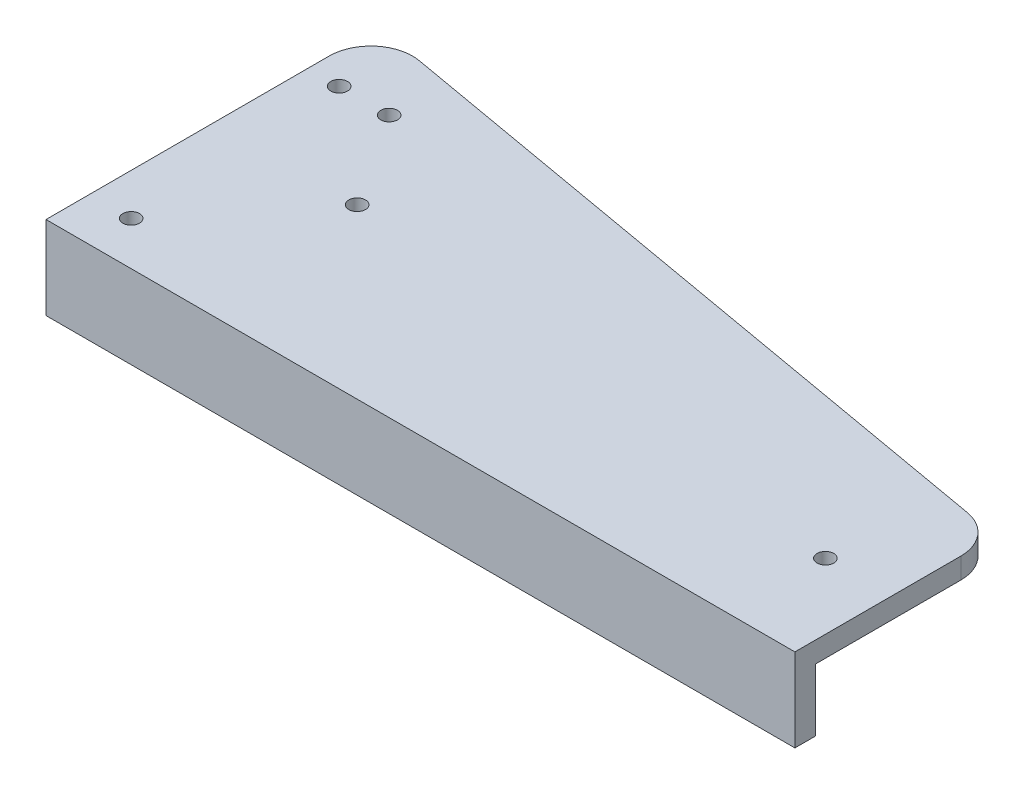
ISO-10303-21;
HEADER;
FILE_DESCRIPTION(('STEP AP214'),'2;1');
FILE_NAME('part.step','',(''),(''),'','','');
FILE_SCHEMA(('AUTOMOTIVE_DESIGN { 1 0 10303 214 1 1 1 1 }'));
ENDSEC;
DATA;
#1=APPLICATION_CONTEXT('core data for automotive mechanical design processes');
#2=APPLICATION_PROTOCOL_DEFINITION('international standard','automotive_design',2000,#1);
#3=PRODUCT_CONTEXT('',#1,'mechanical');
#4=PRODUCT('Part','Part','',(#3));
#5=PRODUCT_RELATED_PRODUCT_CATEGORY('part','',(#4));
#6=PRODUCT_DEFINITION_FORMATION('','',#4);
#7=PRODUCT_DEFINITION_CONTEXT('part definition',#1,'design');
#8=PRODUCT_DEFINITION('design','',#6,#7);
#9=PRODUCT_DEFINITION_SHAPE('','',#8);
#10=(LENGTH_UNIT() NAMED_UNIT(*) SI_UNIT(.MILLI.,.METRE.));
#11=(NAMED_UNIT(*) PLANE_ANGLE_UNIT() SI_UNIT($,.RADIAN.));
#12=(NAMED_UNIT(*) SI_UNIT($,.STERADIAN.) SOLID_ANGLE_UNIT());
#13=UNCERTAINTY_MEASURE_WITH_UNIT(LENGTH_MEASURE(1.E-05),#10,'distance_accuracy_value','');
#14=(GEOMETRIC_REPRESENTATION_CONTEXT(3) GLOBAL_UNCERTAINTY_ASSIGNED_CONTEXT((#13)) GLOBAL_UNIT_ASSIGNED_CONTEXT((#10,
#11,#12)) REPRESENTATION_CONTEXT('',''));
#15=CARTESIAN_POINT('',(0.,0.,0.));
#16=DIRECTION('',(0.,0.,1.));
#17=DIRECTION('',(1.,0.,0.));
#18=AXIS2_PLACEMENT_3D('',#15,#16,#17);
#19=CARTESIAN_POINT('',(0.,0.,0.));
#20=DIRECTION('',(0.,1.,0.));
#21=DIRECTION('',(0.,0.,1.));
#22=AXIS2_PLACEMENT_3D('',#19,#20,#21);
#23=PLANE('',#22);
#24=CARTESIAN_POINT('',(-34.0680960469009,0.,-28.575));
#25=DIRECTION('',(0.,1.,0.));
#26=DIRECTION('',(0.,0.,1.));
#27=AXIS2_PLACEMENT_3D('',#24,#25,#26);
#28=CIRCLE('',#27,2.5527);
#29=CARTESIAN_POINT('',(-34.0680960469009,0.,-26.0223));
#30=VERTEX_POINT('',#29);
#31=EDGE_CURVE('E183',#30,#30,#28,.T.);
#32=ORIENTED_EDGE('',*,*,#31,.T.);
#33=EDGE_LOOP('',(#32));
#34=FACE_BOUND('',#33,.T.);
#35=CARTESIAN_POINT('',(-18.8280960469009,0.,-28.575));
#36=DIRECTION('',(0.,1.,0.));
#37=DIRECTION('',(0.,0.,1.));
#38=AXIS2_PLACEMENT_3D('',#35,#36,#37);
#39=CIRCLE('',#38,2.5527);
#40=CARTESIAN_POINT('',(-18.8280960469009,0.,-26.0223));
#41=VERTEX_POINT('',#40);
#42=EDGE_CURVE('E151',#41,#41,#39,.T.);
#43=ORIENTED_EDGE('',*,*,#42,.T.);
#44=EDGE_LOOP('',(#43));
#45=FACE_BOUND('',#44,.T.);
#46=CARTESIAN_POINT('',(0.,0.,0.));
#47=DIRECTION('',(0.,1.,0.));
#48=DIRECTION('',(0.,0.,1.));
#49=AXIS2_PLACEMENT_3D('',#46,#47,#48);
#50=CIRCLE('',#49,2.5527);
#51=CARTESIAN_POINT('',(0.,0.,2.5527));
#52=VERTEX_POINT('',#51);
#53=EDGE_CURVE('E146',#52,#52,#50,.T.);
#54=ORIENTED_EDGE('',*,*,#53,.T.);
#55=EDGE_LOOP('',(#54));
#56=FACE_BOUND('',#55,.T.);
#57=CARTESIAN_POINT('',(-30.8930960469009,0.,38.1));
#58=DIRECTION('',(0.,1.,0.));
#59=DIRECTION('',(0.,0.,1.));
#60=AXIS2_PLACEMENT_3D('',#57,#58,#59);
#61=CIRCLE('',#60,2.5527);
#62=CARTESIAN_POINT('',(-30.8930960469009,0.,40.6527));
#63=VERTEX_POINT('',#62);
#64=EDGE_CURVE('E195',#63,#63,#61,.T.);
#65=ORIENTED_EDGE('',*,*,#64,.T.);
#66=EDGE_LOOP('',(#65));
#67=FACE_BOUND('',#66,.T.);
#68=CARTESIAN_POINT('',(164.907701135125,0.,21.9875101453017));
#69=DIRECTION('',(0.,1.,0.));
#70=DIRECTION('',(0.,0.,1.));
#71=AXIS2_PLACEMENT_3D('',#68,#69,#70);
#72=CIRCLE('',#71,2.55269999999999);
#73=CARTESIAN_POINT('',(164.907701135125,0.,24.5402101453017));
#74=VERTEX_POINT('',#73);
#75=EDGE_CURVE('E201',#74,#74,#72,.T.);
#76=ORIENTED_EDGE('',*,*,#75,.T.);
#77=EDGE_LOOP('',(#76));
#78=FACE_BOUND('',#77,.T.);
#79=DIRECTION('',(0.,0.,1.));
#80=VECTOR('',#79,1.);
#81=CARTESIAN_POINT('',(-43.5930960469009,0.,-50.2022855012514));
#82=LINE('',#81,#80);
#83=CARTESIAN_POINT('',(-43.5930960469009,0.,-35.067014875305));
#84=VERTEX_POINT('',#83);
#85=CARTESIAN_POINT('',(-43.5930960469009,0.,45.0477144987486));
#86=VERTEX_POINT('',#85);
#87=EDGE_CURVE('E125',#84,#86,#82,.T.);
#88=ORIENTED_EDGE('',*,*,#87,.F.);
#89=CARTESIAN_POINT('',(-30.8930960469009,0.,-35.067014875305));
#90=DIRECTION('',(0.,1.,0.));
#91=DIRECTION('',(0.,0.,1.));
#92=AXIS2_PLACEMENT_3D('',#89,#90,#91);
#93=CIRCLE('',#92,12.7);
#94=CARTESIAN_POINT('',(-28.687764190531,0.,-47.5740733385601));
#95=VERTEX_POINT('',#94);
#96=EDGE_CURVE('E158',#84,#95,#93,.F.);
#97=ORIENTED_EDGE('',*,*,#96,.T.);
#98=DIRECTION('',(0.984807753012209,0.,0.173648177666923));
#99=VECTOR('',#98,1.);
#100=CARTESIAN_POINT('',(7.27060375399845,0.,-41.2336428876974));
#101=LINE('',#100,#99);
#102=CARTESIAN_POINT('',(174.512235809469,0.,-11.7444308586015));
#103=VERTEX_POINT('',#102);
#104=EDGE_CURVE('E176',#95,#103,#101,.T.);
#105=ORIENTED_EDGE('',*,*,#104,.T.);
#106=CARTESIAN_POINT('',(172.306903953099,0.,0.762627604653579));
#107=DIRECTION('',(0.,1.,0.));
#108=DIRECTION('',(0.,0.,1.));
#109=AXIS2_PLACEMENT_3D('',#106,#107,#108);
#110=CIRCLE('',#109,12.7);
#111=CARTESIAN_POINT('',(185.006903953099,0.,0.762627604653579));
#112=VERTEX_POINT('',#111);
#113=EDGE_CURVE('E156',#103,#112,#110,.F.);
#114=ORIENTED_EDGE('',*,*,#113,.T.);
#115=DIRECTION('',(0.,0.,-1.));
#116=VECTOR('',#115,1.);
#117=CARTESIAN_POINT('',(185.006903953099,0.,-50.2022855012514));
#118=LINE('',#117,#116);
#119=CARTESIAN_POINT('',(185.006903953099,0.,45.0477144987486));
#120=VERTEX_POINT('',#119);
#121=EDGE_CURVE('E128',#120,#112,#118,.T.);
#122=ORIENTED_EDGE('',*,*,#121,.F.);
#123=DIRECTION('',(1.,0.,0.));
#124=VECTOR('',#123,1.);
#125=CARTESIAN_POINT('',(-43.5930960469009,0.,45.0477144987486));
#126=LINE('',#125,#124);
#127=EDGE_CURVE('E119',#86,#120,#126,.T.);
#128=ORIENTED_EDGE('',*,*,#127,.F.);
#129=EDGE_LOOP('',(#88,#97,#105,#114,#122,#128));
#130=FACE_BOUND('',#129,.T.);
#131=ADVANCED_FACE('F33',(#34,#45,#56,#67,#78,#130),#23,.F.);
#132=CARTESIAN_POINT('',(-43.5930960469009,6.35,-50.2022855012514));
#133=DIRECTION('',(1.,0.,0.));
#134=DIRECTION('',(0.,0.,-1.));
#135=AXIS2_PLACEMENT_3D('',#132,#133,#134);
#136=PLANE('',#135);
#137=DIRECTION('',(0.,0.,1.));
#138=VECTOR('',#137,1.);
#139=CARTESIAN_POINT('',(-43.5930960469009,6.35,-50.2022855012514));
#140=LINE('',#139,#138);
#141=CARTESIAN_POINT('',(-43.5930960469009,6.35,-35.067014875305));
#142=VERTEX_POINT('',#141);
#143=CARTESIAN_POINT('',(-43.5930960469009,6.35,51.3977144987486));
#144=VERTEX_POINT('',#143);
#145=EDGE_CURVE('E133',#142,#144,#140,.T.);
#146=ORIENTED_EDGE('',*,*,#145,.F.);
#147=DIRECTION('',(0.,-1.,0.));
#148=VECTOR('',#147,1.);
#149=CARTESIAN_POINT('',(-43.5930960469009,6.35,-35.067014875305));
#150=LINE('',#149,#148);
#151=EDGE_CURVE('E145',#142,#84,#150,.T.);
#152=ORIENTED_EDGE('',*,*,#151,.T.);
#153=ORIENTED_EDGE('',*,*,#87,.T.);
#154=DIRECTION('',(0.,1.,0.));
#155=VECTOR('',#154,1.);
#156=CARTESIAN_POINT('',(-43.5930960469009,-19.05,45.0477144987486));
#157=LINE('',#156,#155);
#158=CARTESIAN_POINT('',(-43.5930960469009,-19.05,45.0477144987486));
#159=VERTEX_POINT('',#158);
#160=EDGE_CURVE('E103',#159,#86,#157,.T.);
#161=ORIENTED_EDGE('',*,*,#160,.F.);
#162=DIRECTION('',(0.,0.,-1.));
#163=VECTOR('',#162,1.);
#164=CARTESIAN_POINT('',(-43.5930960469009,-19.05,51.3977144987486));
#165=LINE('',#164,#163);
#166=CARTESIAN_POINT('',(-43.5930960469009,-19.05,51.3977144987486));
#167=VERTEX_POINT('',#166);
#168=EDGE_CURVE('E110',#167,#159,#165,.T.);
#169=ORIENTED_EDGE('',*,*,#168,.F.);
#170=DIRECTION('',(0.,-1.,0.));
#171=VECTOR('',#170,1.);
#172=CARTESIAN_POINT('',(-43.5930960469009,6.35,51.3977144987486));
#173=LINE('',#172,#171);
#174=EDGE_CURVE('E143',#144,#167,#173,.T.);
#175=ORIENTED_EDGE('',*,*,#174,.F.);
#176=EDGE_LOOP('',(#146,#152,#153,#161,#169,#175));
#177=FACE_BOUND('',#176,.T.);
#178=ADVANCED_FACE('F122',(#177),#136,.F.);
#179=CARTESIAN_POINT('',(-43.5930960469009,6.35,51.3977144987486));
#180=DIRECTION('',(0.,0.,-1.));
#181=DIRECTION('',(-1.,0.,0.));
#182=AXIS2_PLACEMENT_3D('',#179,#180,#181);
#183=PLANE('',#182);
#184=ORIENTED_EDGE('',*,*,#174,.T.);
#185=DIRECTION('',(-1.,0.,0.));
#186=VECTOR('',#185,1.);
#187=CARTESIAN_POINT('',(-43.5930960469009,-19.05,51.3977144987486));
#188=LINE('',#187,#186);
#189=CARTESIAN_POINT('',(185.006903953099,-19.05,51.3977144987486));
#190=VERTEX_POINT('',#189);
#191=EDGE_CURVE('E116',#190,#167,#188,.T.);
#192=ORIENTED_EDGE('',*,*,#191,.F.);
#193=DIRECTION('',(0.,-1.,0.));
#194=VECTOR('',#193,1.);
#195=CARTESIAN_POINT('',(185.006903953099,6.35,51.3977144987486));
#196=LINE('',#195,#194);
#197=CARTESIAN_POINT('',(185.006903953099,6.35,51.3977144987486));
#198=VERTEX_POINT('',#197);
#199=EDGE_CURVE('E138',#198,#190,#196,.T.);
#200=ORIENTED_EDGE('',*,*,#199,.F.);
#201=DIRECTION('',(1.,0.,0.));
#202=VECTOR('',#201,1.);
#203=CARTESIAN_POINT('',(-43.5930960469009,6.35,51.3977144987486));
#204=LINE('',#203,#202);
#205=EDGE_CURVE('E135',#144,#198,#204,.T.);
#206=ORIENTED_EDGE('',*,*,#205,.F.);
#207=EDGE_LOOP('',(#184,#192,#200,#206));
#208=FACE_BOUND('',#207,.T.);
#209=ADVANCED_FACE('F210',(#208),#183,.F.);
#210=CARTESIAN_POINT('',(185.006903953099,6.35,-50.2022855012514));
#211=DIRECTION('',(-1.,0.,0.));
#212=DIRECTION('',(0.,0.,1.));
#213=AXIS2_PLACEMENT_3D('',#210,#211,#212);
#214=PLANE('',#213);
#215=ORIENTED_EDGE('',*,*,#121,.T.);
#216=DIRECTION('',(0.,1.,0.));
#217=VECTOR('',#216,1.);
#218=CARTESIAN_POINT('',(185.006903953099,6.35,0.762627604653579));
#219=LINE('',#218,#217);
#220=CARTESIAN_POINT('',(185.006903953099,6.35,0.762627604653579));
#221=VERTEX_POINT('',#220);
#222=EDGE_CURVE('E11',#112,#221,#219,.T.);
#223=ORIENTED_EDGE('',*,*,#222,.T.);
#224=DIRECTION('',(0.,0.,-1.));
#225=VECTOR('',#224,1.);
#226=CARTESIAN_POINT('',(185.006903953099,6.35,-50.2022855012514));
#227=LINE('',#226,#225);
#228=EDGE_CURVE('E137',#198,#221,#227,.T.);
#229=ORIENTED_EDGE('',*,*,#228,.F.);
#230=ORIENTED_EDGE('',*,*,#199,.T.);
#231=DIRECTION('',(0.,0.,1.));
#232=VECTOR('',#231,1.);
#233=CARTESIAN_POINT('',(185.006903953099,-19.05,51.3977144987486));
#234=LINE('',#233,#232);
#235=CARTESIAN_POINT('',(185.006903953099,-19.05,45.0477144987486));
#236=VERTEX_POINT('',#235);
#237=EDGE_CURVE('E109',#236,#190,#234,.T.);
#238=ORIENTED_EDGE('',*,*,#237,.F.);
#239=DIRECTION('',(0.,1.,0.));
#240=VECTOR('',#239,1.);
#241=CARTESIAN_POINT('',(185.006903953099,-19.05,45.0477144987486));
#242=LINE('',#241,#240);
#243=EDGE_CURVE('E105',#236,#120,#242,.T.);
#244=ORIENTED_EDGE('',*,*,#243,.T.);
#245=EDGE_LOOP('',(#215,#223,#229,#230,#238,#244));
#246=FACE_BOUND('',#245,.T.);
#247=ADVANCED_FACE('F206',(#246),#214,.F.);
#248=CARTESIAN_POINT('',(0.,6.35,0.));
#249=DIRECTION('',(0.,1.,0.));
#250=DIRECTION('',(0.,0.,1.));
#251=AXIS2_PLACEMENT_3D('',#248,#249,#250);
#252=PLANE('',#251);
#253=DIRECTION('',(0.984807753012209,0.,0.173648177666923));
#254=VECTOR('',#253,1.);
#255=CARTESIAN_POINT('',(-43.5930960469009,6.35,-50.2022855012514));
#256=LINE('',#255,#254);
#257=CARTESIAN_POINT('',(-28.687764190531,6.35,-47.5740733385601));
#258=VERTEX_POINT('',#257);
#259=CARTESIAN_POINT('',(174.512235809469,6.35,-11.7444308586015));
#260=VERTEX_POINT('',#259);
#261=EDGE_CURVE('E168',#258,#260,#256,.T.);
#262=ORIENTED_EDGE('',*,*,#261,.F.);
#263=CARTESIAN_POINT('',(-30.8930960469009,6.35,-35.067014875305));
#264=DIRECTION('',(0.,1.,0.));
#265=DIRECTION('',(0.,0.,1.));
#266=AXIS2_PLACEMENT_3D('',#263,#264,#265);
#267=CIRCLE('',#266,12.7);
#268=EDGE_CURVE('E41',#258,#142,#267,.T.);
#269=ORIENTED_EDGE('',*,*,#268,.T.);
#270=ORIENTED_EDGE('',*,*,#145,.T.);
#271=ORIENTED_EDGE('',*,*,#205,.T.);
#272=ORIENTED_EDGE('',*,*,#228,.T.);
#273=CARTESIAN_POINT('',(172.306903953099,6.35,0.762627604653579));
#274=DIRECTION('',(0.,1.,0.));
#275=DIRECTION('',(0.,0.,1.));
#276=AXIS2_PLACEMENT_3D('',#273,#274,#275);
#277=CIRCLE('',#276,12.7);
#278=EDGE_CURVE('E48',#221,#260,#277,.T.);
#279=ORIENTED_EDGE('',*,*,#278,.T.);
#280=EDGE_LOOP('',(#262,#269,#270,#271,#272,#279));
#281=FACE_BOUND('',#280,.T.);
#282=CARTESIAN_POINT('',(-34.0680960469009,6.35,-28.575));
#283=DIRECTION('',(0.,1.,0.));
#284=DIRECTION('',(0.,0.,1.));
#285=AXIS2_PLACEMENT_3D('',#282,#283,#284);
#286=CIRCLE('',#285,2.5527);
#287=CARTESIAN_POINT('',(-34.0680960469009,6.35,-26.0223));
#288=VERTEX_POINT('',#287);
#289=EDGE_CURVE('E180',#288,#288,#286,.T.);
#290=ORIENTED_EDGE('',*,*,#289,.F.);
#291=EDGE_LOOP('',(#290));
#292=FACE_BOUND('',#291,.T.);
#293=CARTESIAN_POINT('',(-18.8280960469009,6.35,-28.575));
#294=DIRECTION('',(0.,1.,0.));
#295=DIRECTION('',(0.,0.,1.));
#296=AXIS2_PLACEMENT_3D('',#293,#294,#295);
#297=CIRCLE('',#296,2.5527);
#298=CARTESIAN_POINT('',(-18.8280960469009,6.35,-26.0223));
#299=VERTEX_POINT('',#298);
#300=EDGE_CURVE('E154',#299,#299,#297,.T.);
#301=ORIENTED_EDGE('',*,*,#300,.F.);
#302=EDGE_LOOP('',(#301));
#303=FACE_BOUND('',#302,.T.);
#304=CARTESIAN_POINT('',(0.,6.35,0.));
#305=DIRECTION('',(0.,1.,0.));
#306=DIRECTION('',(0.,0.,1.));
#307=AXIS2_PLACEMENT_3D('',#304,#305,#306);
#308=CIRCLE('',#307,2.5527);
#309=CARTESIAN_POINT('',(0.,6.35,2.5527));
#310=VERTEX_POINT('',#309);
#311=EDGE_CURVE('E150',#310,#310,#308,.T.);
#312=ORIENTED_EDGE('',*,*,#311,.F.);
#313=EDGE_LOOP('',(#312));
#314=FACE_BOUND('',#313,.T.);
#315=CARTESIAN_POINT('',(-30.8930960469009,6.35,38.1));
#316=DIRECTION('',(0.,1.,0.));
#317=DIRECTION('',(0.,0.,1.));
#318=AXIS2_PLACEMENT_3D('',#315,#316,#317);
#319=CIRCLE('',#318,2.5527);
#320=CARTESIAN_POINT('',(-30.8930960469009,6.35,40.6527));
#321=VERTEX_POINT('',#320);
#322=EDGE_CURVE('E149',#321,#321,#319,.T.);
#323=ORIENTED_EDGE('',*,*,#322,.F.);
#324=EDGE_LOOP('',(#323));
#325=FACE_BOUND('',#324,.T.);
#326=CARTESIAN_POINT('',(164.907701135125,6.35,21.9875101453017));
#327=DIRECTION('',(0.,1.,0.));
#328=DIRECTION('',(0.,0.,1.));
#329=AXIS2_PLACEMENT_3D('',#326,#327,#328);
#330=CIRCLE('',#329,2.55269999999999);
#331=CARTESIAN_POINT('',(164.907701135125,6.35,24.5402101453017));
#332=VERTEX_POINT('',#331);
#333=EDGE_CURVE('E198',#332,#332,#330,.T.);
#334=ORIENTED_EDGE('',*,*,#333,.F.);
#335=EDGE_LOOP('',(#334));
#336=FACE_BOUND('',#335,.T.);
#337=ADVANCED_FACE('F165',(#281,#292,#303,#314,#325,#336),#252,.T.);
#338=CARTESIAN_POINT('',(-43.5930960469009,-19.05,45.0477144987486));
#339=DIRECTION('',(0.,0.,1.));
#340=DIRECTION('',(1.,0.,0.));
#341=AXIS2_PLACEMENT_3D('',#338,#339,#340);
#342=PLANE('',#341);
#343=ORIENTED_EDGE('',*,*,#127,.T.);
#344=ORIENTED_EDGE('',*,*,#243,.F.);
#345=DIRECTION('',(1.,0.,0.));
#346=VECTOR('',#345,1.);
#347=CARTESIAN_POINT('',(-43.5930960469009,-19.05,45.0477144987486));
#348=LINE('',#347,#346);
#349=EDGE_CURVE('E98',#159,#236,#348,.T.);
#350=ORIENTED_EDGE('',*,*,#349,.F.);
#351=ORIENTED_EDGE('',*,*,#160,.T.);
#352=EDGE_LOOP('',(#343,#344,#350,#351));
#353=FACE_BOUND('',#352,.T.);
#354=ADVANCED_FACE('F101',(#353),#342,.F.);
#355=CARTESIAN_POINT('',(0.,-19.05,0.));
#356=DIRECTION('',(0.,-1.,0.));
#357=DIRECTION('',(0.,0.,-1.));
#358=AXIS2_PLACEMENT_3D('',#355,#356,#357);
#359=PLANE('',#358);
#360=ORIENTED_EDGE('',*,*,#168,.T.);
#361=ORIENTED_EDGE('',*,*,#349,.T.);
#362=ORIENTED_EDGE('',*,*,#237,.T.);
#363=ORIENTED_EDGE('',*,*,#191,.T.);
#364=EDGE_LOOP('',(#360,#361,#362,#363));
#365=FACE_BOUND('',#364,.T.);
#366=ADVANCED_FACE('F114',(#365),#359,.T.);
#367=CARTESIAN_POINT('',(164.907701135125,6.35,21.9875101453017));
#368=DIRECTION('',(0.,1.,0.));
#369=DIRECTION('',(0.,0.,1.));
#370=AXIS2_PLACEMENT_3D('',#367,#368,#369);
#371=CYLINDRICAL_SURFACE('',#370,2.55269999999999);
#372=ORIENTED_EDGE('',*,*,#333,.T.);
#373=EDGE_LOOP('',(#372));
#374=FACE_BOUND('',#373,.T.);
#375=ORIENTED_EDGE('',*,*,#75,.F.);
#376=EDGE_LOOP('',(#375));
#377=FACE_BOUND('',#376,.T.);
#378=ADVANCED_FACE('F254',(#374,#377),#371,.F.);
#379=CARTESIAN_POINT('',(-30.8930960469009,6.35,38.1));
#380=DIRECTION('',(0.,1.,0.));
#381=DIRECTION('',(0.,0.,1.));
#382=AXIS2_PLACEMENT_3D('',#379,#380,#381);
#383=CYLINDRICAL_SURFACE('',#382,2.5527);
#384=ORIENTED_EDGE('',*,*,#322,.T.);
#385=EDGE_LOOP('',(#384));
#386=FACE_BOUND('',#385,.T.);
#387=ORIENTED_EDGE('',*,*,#64,.F.);
#388=EDGE_LOOP('',(#387));
#389=FACE_BOUND('',#388,.T.);
#390=ADVANCED_FACE('F261',(#386,#389),#383,.F.);
#391=CARTESIAN_POINT('',(0.,6.35,0.));
#392=DIRECTION('',(0.,1.,0.));
#393=DIRECTION('',(0.,0.,1.));
#394=AXIS2_PLACEMENT_3D('',#391,#392,#393);
#395=CYLINDRICAL_SURFACE('',#394,2.5527);
#396=ORIENTED_EDGE('',*,*,#311,.T.);
#397=EDGE_LOOP('',(#396));
#398=FACE_BOUND('',#397,.T.);
#399=ORIENTED_EDGE('',*,*,#53,.F.);
#400=EDGE_LOOP('',(#399));
#401=FACE_BOUND('',#400,.T.);
#402=ADVANCED_FACE('F269',(#398,#401),#395,.F.);
#403=CARTESIAN_POINT('',(-18.8280960469009,6.35,-28.575));
#404=DIRECTION('',(0.,1.,0.));
#405=DIRECTION('',(0.,0.,1.));
#406=AXIS2_PLACEMENT_3D('',#403,#404,#405);
#407=CYLINDRICAL_SURFACE('',#406,2.5527);
#408=ORIENTED_EDGE('',*,*,#300,.T.);
#409=EDGE_LOOP('',(#408));
#410=FACE_BOUND('',#409,.T.);
#411=ORIENTED_EDGE('',*,*,#42,.F.);
#412=EDGE_LOOP('',(#411));
#413=FACE_BOUND('',#412,.T.);
#414=ADVANCED_FACE('F277',(#410,#413),#407,.F.);
#415=CARTESIAN_POINT('',(-34.0680960469009,6.35,-28.575));
#416=DIRECTION('',(0.,1.,0.));
#417=DIRECTION('',(0.,0.,1.));
#418=AXIS2_PLACEMENT_3D('',#415,#416,#417);
#419=CYLINDRICAL_SURFACE('',#418,2.5527);
#420=ORIENTED_EDGE('',*,*,#289,.T.);
#421=EDGE_LOOP('',(#420));
#422=FACE_BOUND('',#421,.T.);
#423=ORIENTED_EDGE('',*,*,#31,.F.);
#424=EDGE_LOOP('',(#423));
#425=FACE_BOUND('',#424,.T.);
#426=ADVANCED_FACE('F285',(#422,#425),#419,.F.);
#427=CARTESIAN_POINT('',(-43.5930960469009,-19.05,-50.2022855012514));
#428=DIRECTION('',(-0.173648177666923,0.,0.984807753012209));
#429=DIRECTION('',(0.984807753012209,0.,0.173648177666923));
#430=AXIS2_PLACEMENT_3D('',#427,#428,#429);
#431=PLANE('',#430);
#432=ORIENTED_EDGE('',*,*,#104,.F.);
#433=DIRECTION('',(0.,-1.,0.));
#434=VECTOR('',#433,1.);
#435=CARTESIAN_POINT('',(-28.687764190531,-19.05,-47.5740733385601));
#436=LINE('',#435,#434);
#437=EDGE_CURVE('E162',#95,#258,#436,.F.);
#438=ORIENTED_EDGE('',*,*,#437,.T.);
#439=ORIENTED_EDGE('',*,*,#261,.T.);
#440=DIRECTION('',(0.,1.,0.));
#441=VECTOR('',#440,1.);
#442=CARTESIAN_POINT('',(174.512235809469,-19.05,-11.7444308586015));
#443=LINE('',#442,#441);
#444=EDGE_CURVE('E160',#260,#103,#443,.F.);
#445=ORIENTED_EDGE('',*,*,#444,.T.);
#446=EDGE_LOOP('',(#432,#438,#439,#445));
#447=FACE_BOUND('',#446,.T.);
#448=ADVANCED_FACE('F179',(#447),#431,.F.);
#449=CARTESIAN_POINT('',(-30.8930960469009,6.35,-35.067014875305));
#450=DIRECTION('',(0.,-1.,0.));
#451=DIRECTION('',(0.,0.,-1.));
#452=AXIS2_PLACEMENT_3D('',#449,#450,#451);
#453=CYLINDRICAL_SURFACE('',#452,12.7);
#454=ORIENTED_EDGE('',*,*,#268,.F.);
#455=ORIENTED_EDGE('',*,*,#437,.F.);
#456=ORIENTED_EDGE('',*,*,#96,.F.);
#457=ORIENTED_EDGE('',*,*,#151,.F.);
#458=EDGE_LOOP('',(#454,#455,#456,#457));
#459=FACE_BOUND('',#458,.T.);
#460=ADVANCED_FACE('F172',(#459),#453,.T.);
#461=CARTESIAN_POINT('',(172.306903953099,6.35,0.762627604653579));
#462=DIRECTION('',(0.,1.,0.));
#463=DIRECTION('',(0.,0.,1.));
#464=AXIS2_PLACEMENT_3D('',#461,#462,#463);
#465=CYLINDRICAL_SURFACE('',#464,12.7);
#466=ORIENTED_EDGE('',*,*,#113,.F.);
#467=ORIENTED_EDGE('',*,*,#444,.F.);
#468=ORIENTED_EDGE('',*,*,#278,.F.);
#469=ORIENTED_EDGE('',*,*,#222,.F.);
#470=EDGE_LOOP('',(#466,#467,#468,#469));
#471=FACE_BOUND('',#470,.T.);
#472=ADVANCED_FACE('F35',(#471),#465,.T.);
#473=CLOSED_SHELL('',(#131,#178,#209,#247,#337,#354,#366,#378,#390,#402,#414,#426,#448,#460,#472));
#474=MANIFOLD_SOLID_BREP('B2',#473);
#475=ADVANCED_BREP_SHAPE_REPRESENTATION('',(#18,#474),#14);
#476=SHAPE_DEFINITION_REPRESENTATION(#9,#475);
ENDSEC;
END-ISO-10303-21;
